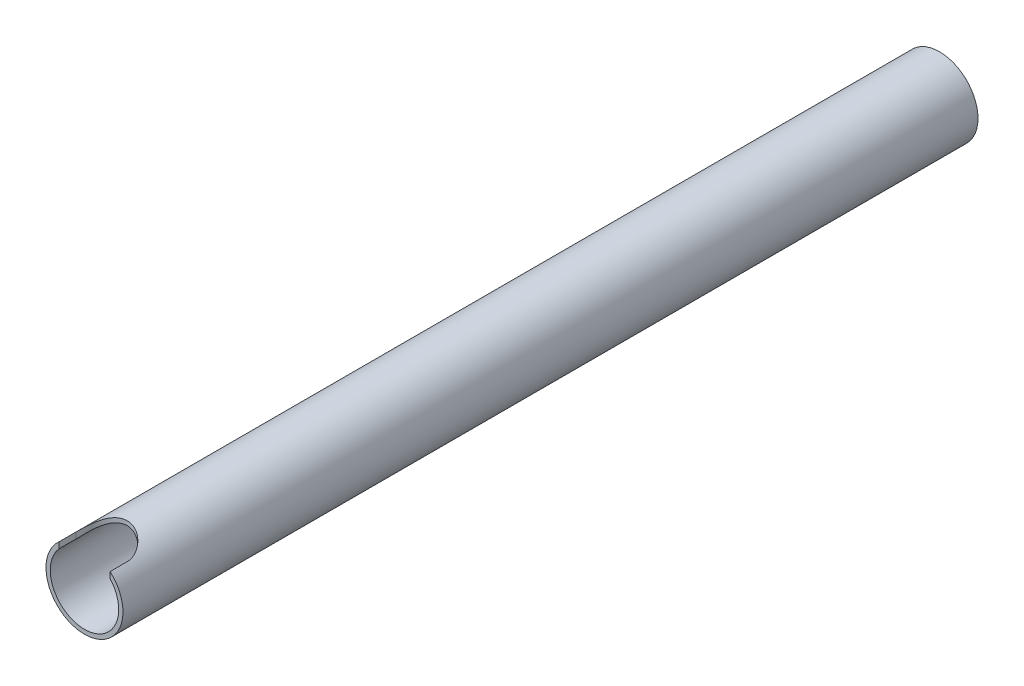
ISO-10303-21;
HEADER;
FILE_DESCRIPTION(('STEP AP214'),'2;1');
FILE_NAME('part.step','',(''),(''),'','','');
FILE_SCHEMA(('AUTOMOTIVE_DESIGN { 1 0 10303 214 1 1 1 1 }'));
ENDSEC;
DATA;
#1=APPLICATION_CONTEXT('core data for automotive mechanical design processes');
#2=APPLICATION_PROTOCOL_DEFINITION('international standard','automotive_design',2000,#1);
#3=PRODUCT_CONTEXT('',#1,'mechanical');
#4=PRODUCT('Part','Part','',(#3));
#5=PRODUCT_RELATED_PRODUCT_CATEGORY('part','',(#4));
#6=PRODUCT_DEFINITION_FORMATION('','',#4);
#7=PRODUCT_DEFINITION_CONTEXT('part definition',#1,'design');
#8=PRODUCT_DEFINITION('design','',#6,#7);
#9=PRODUCT_DEFINITION_SHAPE('','',#8);
#10=(LENGTH_UNIT() NAMED_UNIT(*) SI_UNIT(.MILLI.,.METRE.));
#11=(NAMED_UNIT(*) PLANE_ANGLE_UNIT() SI_UNIT($,.RADIAN.));
#12=(NAMED_UNIT(*) SI_UNIT($,.STERADIAN.) SOLID_ANGLE_UNIT());
#13=UNCERTAINTY_MEASURE_WITH_UNIT(LENGTH_MEASURE(1.E-05),#10,'distance_accuracy_value','');
#14=(GEOMETRIC_REPRESENTATION_CONTEXT(3) GLOBAL_UNCERTAINTY_ASSIGNED_CONTEXT((#13)) GLOBAL_UNIT_ASSIGNED_CONTEXT((#10,
#11,#12)) REPRESENTATION_CONTEXT('',''));
#15=CARTESIAN_POINT('',(0.,0.,0.));
#16=DIRECTION('',(0.,0.,1.));
#17=DIRECTION('',(1.,0.,0.));
#18=AXIS2_PLACEMENT_3D('',#15,#16,#17);
#19=CARTESIAN_POINT('',(0.,0.,200.));
#20=DIRECTION('',(0.,0.,1.));
#21=DIRECTION('',(1.,0.,0.));
#22=AXIS2_PLACEMENT_3D('',#19,#20,#21);
#23=PLANE('',#22);
#24=DIRECTION('',(0.,-1.,0.));
#25=VECTOR('',#24,1.);
#26=CARTESIAN_POINT('',(-6.,0.,200.));
#27=LINE('',#26,#25);
#28=CARTESIAN_POINT('',(-6.,6.70820393249937,200.));
#29=VERTEX_POINT('',#28);
#30=CARTESIAN_POINT('',(-6.,5.29150262212918,200.));
#31=VERTEX_POINT('',#30);
#32=EDGE_CURVE('E118',#29,#31,#27,.T.);
#33=ORIENTED_EDGE('',*,*,#32,.F.);
#34=CARTESIAN_POINT('',(0.,0.,200.));
#35=DIRECTION('',(0.,0.,1.));
#36=DIRECTION('',(1.,0.,0.));
#37=AXIS2_PLACEMENT_3D('',#34,#35,#36);
#38=CIRCLE('',#37,9.);
#39=CARTESIAN_POINT('',(6.,6.70820393249937,200.));
#40=VERTEX_POINT('',#39);
#41=EDGE_CURVE('E171',#29,#40,#38,.T.);
#42=ORIENTED_EDGE('',*,*,#41,.T.);
#43=DIRECTION('',(0.,1.,0.));
#44=VECTOR('',#43,1.);
#45=CARTESIAN_POINT('',(6.,0.,200.));
#46=LINE('',#45,#44);
#47=CARTESIAN_POINT('',(6.,5.29150262212918,200.));
#48=VERTEX_POINT('',#47);
#49=EDGE_CURVE('E109',#48,#40,#46,.T.);
#50=ORIENTED_EDGE('',*,*,#49,.F.);
#51=CARTESIAN_POINT('',(0.,0.,200.));
#52=DIRECTION('',(0.,0.,1.));
#53=DIRECTION('',(1.,0.,0.));
#54=AXIS2_PLACEMENT_3D('',#51,#52,#53);
#55=CIRCLE('',#54,8.);
#56=EDGE_CURVE('E162',#31,#48,#55,.T.);
#57=ORIENTED_EDGE('',*,*,#56,.F.);
#58=EDGE_LOOP('',(#33,#42,#50,#57));
#59=FACE_BOUND('',#58,.T.);
#60=ADVANCED_FACE('F43',(#59),#23,.T.);
#61=CARTESIAN_POINT('',(0.,0.,0.));
#62=DIRECTION('',(0.,0.,1.));
#63=DIRECTION('',(1.,0.,0.));
#64=AXIS2_PLACEMENT_3D('',#61,#62,#63);
#65=PLANE('',#64);
#66=CARTESIAN_POINT('',(0.,0.,0.));
#67=DIRECTION('',(0.,0.,1.));
#68=DIRECTION('',(1.,0.,0.));
#69=AXIS2_PLACEMENT_3D('',#66,#67,#68);
#70=CIRCLE('',#69,9.);
#71=CARTESIAN_POINT('',(9.,0.,0.));
#72=VERTEX_POINT('',#71);
#73=EDGE_CURVE('E159',#72,#72,#70,.T.);
#74=ORIENTED_EDGE('',*,*,#73,.F.);
#75=EDGE_LOOP('',(#74));
#76=FACE_BOUND('',#75,.T.);
#77=CARTESIAN_POINT('',(0.,0.,0.));
#78=DIRECTION('',(0.,0.,1.));
#79=DIRECTION('',(1.,0.,0.));
#80=AXIS2_PLACEMENT_3D('',#77,#78,#79);
#81=CIRCLE('',#80,8.);
#82=CARTESIAN_POINT('',(8.,0.,0.));
#83=VERTEX_POINT('',#82);
#84=EDGE_CURVE('E165',#83,#83,#81,.T.);
#85=ORIENTED_EDGE('',*,*,#84,.T.);
#86=EDGE_LOOP('',(#85));
#87=FACE_BOUND('',#86,.T.);
#88=ADVANCED_FACE('F146',(#76,#87),#65,.F.);
#89=CARTESIAN_POINT('',(0.,0.,200.));
#90=DIRECTION('',(0.,0.,-1.));
#91=DIRECTION('',(-1.,0.,0.));
#92=AXIS2_PLACEMENT_3D('',#89,#90,#91);
#93=CYLINDRICAL_SURFACE('',#92,9.);
#94=ORIENTED_EDGE('',*,*,#41,.F.);
#95=DIRECTION('',(0.,0.,-1.));
#96=VECTOR('',#95,1.);
#97=CARTESIAN_POINT('',(-6.,6.70820393249937,200.));
#98=LINE('',#97,#96);
#99=CARTESIAN_POINT('',(-6.,6.70820393249937,196.));
#100=VERTEX_POINT('',#99);
#101=EDGE_CURVE('E74',#29,#100,#98,.T.);
#102=ORIENTED_EDGE('',*,*,#101,.T.);
#103=CARTESIAN_POINT('',(-6.,6.70820393249937,196.));
#104=CARTESIAN_POINT('',(-6.0000393183433,6.70812194573574,195.852506980731));
#105=CARTESIAN_POINT('',(-5.99456347786238,6.71306593091113,195.705061652411));
#106=CARTESIAN_POINT('',(-5.97289327726244,6.73237859024483,195.411774037341));
#107=CARTESIAN_POINT('',(-5.95671328084198,6.74673463431257,195.265929868277));
#108=CARTESIAN_POINT('',(-5.91415607609064,6.78406215747855,194.978375981598));
#109=CARTESIAN_POINT('',(-5.88788106748825,6.8069472231382,194.836639667377));
#110=CARTESIAN_POINT('',(-5.82560066996816,6.86032556958915,194.556763780513));
#111=CARTESIAN_POINT('',(-5.78959245078331,6.89082106317695,194.418625266884));
#112=CARTESIAN_POINT('',(-5.70858199668009,6.95807725230193,194.147428771933));
#113=CARTESIAN_POINT('',(-5.66362787449207,6.994804284088,194.014347963361));
#114=CARTESIAN_POINT('',(-5.56512538409717,7.07342589112545,193.753028706149));
#115=CARTESIAN_POINT('',(-5.51157745308584,7.11532020347504,193.624790011584));
#116=CARTESIAN_POINT('',(-5.33842689493356,7.24722356567827,193.247177913208));
#117=CARTESIAN_POINT('',(-5.20649519991548,7.34329866853642,193.005493595962));
#118=CARTESIAN_POINT('',(-4.88998497472128,7.55844009542074,192.508915856898));
#119=CARTESIAN_POINT('',(-4.70042231706135,7.67876554502885,192.257747766865));
#120=CARTESIAN_POINT('',(-4.38847297427156,7.85848610554915,191.905379210826));
#121=CARTESIAN_POINT('',(-4.27982876675124,7.91829423228407,191.791937198901));
#122=CARTESIAN_POINT('',(-4.05351803224065,8.03649599254022,191.573519899));
#123=CARTESIAN_POINT('',(-3.93584941894303,8.09488929484438,191.468546580438));
#124=CARTESIAN_POINT('',(-3.67410276883844,8.21734571815794,191.25302928572));
#125=CARTESIAN_POINT('',(-3.52867128211092,8.28100042701004,191.143890846029));
#126=CARTESIAN_POINT('',(-3.22705781179329,8.40312749208883,190.938441866567));
#127=CARTESIAN_POINT('',(-3.07088087836644,8.46160225363382,190.842125362347));
#128=CARTESIAN_POINT('',(-2.7485550368627,8.57172289580967,190.663392008808));
#129=CARTESIAN_POINT('',(-2.58241066290611,8.62337184771766,190.580968903514));
#130=CARTESIAN_POINT('',(-2.24117837103793,8.71828288420858,190.431174670396));
#131=CARTESIAN_POINT('',(-2.06609237981828,8.76154676600818,190.363800316619));
#132=CARTESIAN_POINT('',(-1.72849691899763,8.83395011628131,190.251932590202));
#133=CARTESIAN_POINT('',(-1.56677951763714,8.8641295404735,190.205720420075));
#134=CARTESIAN_POINT('',(-1.23871765597762,8.91589255205311,190.126838317575));
#135=CARTESIAN_POINT('',(-1.0723735087317,8.93747671950317,190.094167471343));
#136=CARTESIAN_POINT('',(-0.736763503715932,8.97137649057705,190.042990402912));
#137=CARTESIAN_POINT('',(-0.567500918238733,8.98370186187713,190.024469252972));
#138=CARTESIAN_POINT('',(-0.227596501670302,8.99872901097531,190.001900549956));
#139=CARTESIAN_POINT('',(-0.056954868589227,9.00143214661064,189.997850954732));
#140=CARTESIAN_POINT('',(0.257909828093748,8.99746462243315,190.003803864367));
#141=CARTESIAN_POINT('',(0.40219455835203,8.99216016134809,190.01175826242));
#142=CARTESIAN_POINT('',(0.689453317178941,8.97470670280735,190.037998856573));
#143=CARTESIAN_POINT('',(0.832426917904149,8.96255554664857,190.056288311231));
#144=CARTESIAN_POINT('',(1.11594062243916,8.93168553622766,190.102940433048));
#145=CARTESIAN_POINT('',(1.25648156409055,8.91296899238517,190.131299556643));
#146=CARTESIAN_POINT('',(1.53431926186213,8.86936580246273,190.197735155283));
#147=CARTESIAN_POINT('',(1.67161473732113,8.84447676380638,190.235815398588));
#148=CARTESIAN_POINT('',(1.94151594437167,8.78916401420626,190.321051852994));
#149=CARTESIAN_POINT('',(2.07413974717568,8.75876529383256,190.368167137181));
#150=CARTESIAN_POINT('',(2.33470201598792,8.69294276948524,190.471092998353));
#151=CARTESIAN_POINT('',(2.46263881729357,8.65751720146291,190.526906628487));
#152=CARTESIAN_POINT('',(2.83849835595443,8.5446597697204,190.706612161669));
#153=CARTESIAN_POINT('',(3.07866953915028,8.46060488844629,190.842832550333));
#154=CARTESIAN_POINT('',(3.56489228702402,8.26853604776286,191.1639488568));
#155=CARTESIAN_POINT('',(3.80756841028923,8.15882511006946,191.35288906415));
#156=CARTESIAN_POINT('',(4.25998331649615,7.93199864466213,191.763721415403));
#157=CARTESIAN_POINT('',(4.46967121585829,7.81487206125219,191.985663457895));
#158=CARTESIAN_POINT('',(4.77234020904544,7.63161953706803,192.359155696051));
#159=CARTESIAN_POINT('',(4.8772295945531,7.56482963236636,192.500887078842));
#160=CARTESIAN_POINT('',(5.07463232509068,7.43385178781524,192.793857940915));
#161=CARTESIAN_POINT('',(5.16714277588728,7.36966445889255,192.945099631629));
#162=CARTESIAN_POINT('',(5.424891961227,7.18436432971937,193.412196144449));
#163=CARTESIAN_POINT('',(5.57088509041259,7.07017210785883,193.742080318463));
#164=CARTESIAN_POINT('',(5.77061895485414,6.90737596649755,194.336081892814));
#165=CARTESIAN_POINT('',(5.83874387569329,6.84936009029308,194.592758129275));
#166=CARTESIAN_POINT('',(5.91517353662353,6.78319958018771,194.985829861502));
#167=CARTESIAN_POINT('',(5.93634841066102,6.76463184262495,195.118054286599));
#168=CARTESIAN_POINT('',(5.96984487292608,6.73509265405631,195.384427253078));
#169=CARTESIAN_POINT('',(5.98217199357155,6.7241164562877,195.518574538489));
#170=CARTESIAN_POINT('',(5.99330844907521,6.71418405629563,195.71085756892));
#171=CARTESIAN_POINT('',(5.99581719087049,6.71194322091241,195.768644375282));
#172=CARTESIAN_POINT('',(5.99916266713708,6.70895310557702,195.884284727289));
#173=CARTESIAN_POINT('',(5.99999998296912,6.708203307008,195.942138242723));
#174=CARTESIAN_POINT('',(6.,6.70820393249937,196.));
#175=B_SPLINE_CURVE_WITH_KNOTS('',3,(#103,#104,#105,#106,#107,#108,#109,#110,#111,#112,#113,
#114,#115,#116,#117,#118,#119,#120,#121,#122,#123,#124,#125,#126,#127,#128,#129,#130,#131,#132,
#133,#134,#135,#136,#137,#138,#139,#140,#141,#142,#143,#144,#145,#146,#147,#148,#149,#150,#151,
#152,#153,#154,#155,#156,#157,#158,#159,#160,#161,#162,#163,#164,#165,#166,#167,#168,#169,#170,
#171,#172,#173,#174),.UNSPECIFIED.,.F.,.F.,(4,2,2,2,2,2,2,2,2,2,2,2,2,2,2,2,2,2,2,2,2,2,2,2,2,2,
2,2,2,2,2,2,2,2,2,4),(0.,0.442218902060999,0.883845599550486,1.32111440562802,1.75851049975334,
2.19361485357492,2.62869707920835,3.50073479655623,4.50746081603578,5.01131940006734,
5.5152948218338,6.09247253881144,6.66938082173012,7.2460286341691,7.82255271359904,
8.33441185130012,8.84623643963211,9.35752031133303,9.86873203059137,10.3020102889807,
10.7354252327199,11.1686878065584,11.6021185844215,12.0336305045627,12.4652942294365,
13.3279876664779,14.3040591784731,15.2816218010343,15.8466542882344,16.411818651815,
17.5394361699494,18.3513876988232,18.7565175336659,19.1613938233755,19.3350122681653,
19.5085703139019),.UNSPECIFIED.);
#176=CARTESIAN_POINT('',(6.,6.70820393249937,196.));
#177=VERTEX_POINT('',#176);
#178=EDGE_CURVE('E99',#100,#177,#175,.T.);
#179=ORIENTED_EDGE('',*,*,#178,.T.);
#180=DIRECTION('',(0.,0.,-1.));
#181=VECTOR('',#180,1.);
#182=CARTESIAN_POINT('',(6.,6.70820393249937,200.));
#183=LINE('',#182,#181);
#184=EDGE_CURVE('E108',#177,#40,#183,.F.);
#185=ORIENTED_EDGE('',*,*,#184,.T.);
#186=EDGE_LOOP('',(#94,#102,#179,#185));
#187=FACE_BOUND('',#186,.T.);
#188=ORIENTED_EDGE('',*,*,#73,.T.);
#189=EDGE_LOOP('',(#188));
#190=FACE_BOUND('',#189,.T.);
#191=ADVANCED_FACE('F44',(#187,#190),#93,.T.);
#192=CARTESIAN_POINT('',(0.,0.,200.));
#193=DIRECTION('',(0.,0.,-1.));
#194=DIRECTION('',(-1.,0.,0.));
#195=AXIS2_PLACEMENT_3D('',#192,#193,#194);
#196=CYLINDRICAL_SURFACE('',#195,8.);
#197=DIRECTION('',(0.,0.,-1.));
#198=VECTOR('',#197,1.);
#199=CARTESIAN_POINT('',(-6.,5.29150262212918,200.));
#200=LINE('',#199,#198);
#201=CARTESIAN_POINT('',(-6.,5.29150262212918,196.));
#202=VERTEX_POINT('',#201);
#203=EDGE_CURVE('E11',#31,#202,#200,.T.);
#204=ORIENTED_EDGE('',*,*,#203,.F.);
#205=ORIENTED_EDGE('',*,*,#56,.T.);
#206=DIRECTION('',(0.,0.,-1.));
#207=VECTOR('',#206,1.);
#208=CARTESIAN_POINT('',(6.,5.29150262212918,200.));
#209=LINE('',#208,#207);
#210=CARTESIAN_POINT('',(6.,5.29150262212918,196.));
#211=VERTEX_POINT('',#210);
#212=EDGE_CURVE('E141',#211,#48,#209,.F.);
#213=ORIENTED_EDGE('',*,*,#212,.F.);
#214=CARTESIAN_POINT('',(-6.,5.29150262212918,196.));
#215=CARTESIAN_POINT('',(-6.00000164734553,5.29149746130063,195.929299215689));
#216=CARTESIAN_POINT('',(-5.99874992483121,5.29292042134915,195.858612431604));
#217=CARTESIAN_POINT('',(-5.99375929848811,5.29857251101417,195.717450627859));
#218=CARTESIAN_POINT('',(-5.99002081044604,5.30280117151782,195.646975574775));
#219=CARTESIAN_POINT('',(-5.97512726223536,5.31959499598561,195.436438424863));
#220=CARTESIAN_POINT('',(-5.96029391667244,5.33626847732026,195.296930503187));
#221=CARTESIAN_POINT('',(-5.92146467708413,5.37931891935372,195.02264831947));
#222=CARTESIAN_POINT('',(-5.89758872729309,5.40556869603609,194.887836295229));
#223=CARTESIAN_POINT('',(-5.84118213277231,5.46647153069185,194.621931044734));
#224=CARTESIAN_POINT('',(-5.80864733570754,5.50112861966951,194.49083963616));
#225=CARTESIAN_POINT('',(-5.73578091551817,5.57705609976159,194.234076022853));
#226=CARTESIAN_POINT('',(-5.69551468906141,5.61827055638512,194.108368480834));
#227=CARTESIAN_POINT('',(-5.60752977965139,5.70609193113432,193.861596067816));
#228=CARTESIAN_POINT('',(-5.55981184109297,5.7526983105091,193.740530734582));
#229=CARTESIAN_POINT('',(-5.40571853410941,5.89900121175978,193.383599325024));
#230=CARTESIAN_POINT('',(-5.28863395224688,6.00493049059014,193.154793376452));
#231=CARTESIAN_POINT('',(-5.08003235744934,6.18093054783945,192.803606798809));
#232=CARTESIAN_POINT('',(-4.99673902321449,6.24859868310512,192.674948483868));
#233=CARTESIAN_POINT('',(-4.82093036772026,6.38521973153118,192.424807481964));
#234=CARTESIAN_POINT('',(-4.72841432126793,6.45417274537597,192.303325360472));
#235=CARTESIAN_POINT('',(-4.43720798879207,6.66090963382174,191.949759541453));
#236=CARTESIAN_POINT('',(-4.22484445848777,6.79858453976931,191.728531124821));
#237=CARTESIAN_POINT('',(-3.85677854448346,7.01077089521444,191.400035472149));
#238=CARTESIAN_POINT('',(-3.71206447027489,7.08865432832994,191.282400060903));
#239=CARTESIAN_POINT('',(-3.41024785229984,7.23868552108811,191.05982239082));
#240=CARTESIAN_POINT('',(-3.25314252757324,7.31083198584902,190.954882994809));
#241=CARTESIAN_POINT('',(-2.92748738140682,7.44721036286365,190.759213349274));
#242=CARTESIAN_POINT('',(-2.75895787294117,7.5114557793649,190.668458781422));
#243=CARTESIAN_POINT('',(-2.41119946943849,7.6301911953997,190.502438157635));
#244=CARTESIAN_POINT('',(-2.2319763013099,7.68468635517768,190.427163905697));
#245=CARTESIAN_POINT('',(-1.91981544570525,7.76736517405681,190.313791142147));
#246=CARTESIAN_POINT('',(-1.78923137620704,7.79852622386618,190.271328994596));
#247=CARTESIAN_POINT('',(-1.52422909700309,7.85461977621466,190.195198861307));
#248=CARTESIAN_POINT('',(-1.3898118140051,7.87955377020367,190.161528769686));
#249=CARTESIAN_POINT('',(-1.1180230429965,7.92268544907432,190.103448250311));
#250=CARTESIAN_POINT('',(-0.980653655025508,7.94088776510486,190.079031456338));
#251=CARTESIAN_POINT('',(-0.703792112495761,7.9701977558813,190.03977994756));
#252=CARTESIAN_POINT('',(-0.564299882018418,7.9813051762812,190.024945576277));
#253=CARTESIAN_POINT('',(-0.283857320899895,7.99619868039414,190.005065723171));
#254=CARTESIAN_POINT('',(-0.142904119696008,7.99996542591576,190.000046097089));
#255=CARTESIAN_POINT('',(0.139006716824936,8.00003409940456,189.999954535817));
#256=CARTESIAN_POINT('',(0.279964352122297,7.99633605683647,190.004882561363));
#257=CARTESIAN_POINT('',(0.56082213053902,7.98155736180775,190.024608757108));
#258=CARTESIAN_POINT('',(0.700722059237648,7.97047525097633,190.03940887707));
#259=CARTESIAN_POINT('',(0.978397724164498,7.94117321022885,190.07864865745));
#260=CARTESIAN_POINT('',(1.11617347450189,7.92295332774438,190.103088253812));
#261=CARTESIAN_POINT('',(1.3839551510545,7.88050768014737,190.160243554479));
#262=CARTESIAN_POINT('',(1.51406502760778,7.85651130758527,190.192643953359));
#263=CARTESIAN_POINT('',(1.77072992844799,7.8026752011739,190.265687098327));
#264=CARTESIAN_POINT('',(1.89728371438224,7.7728334599092,190.306332676143));
#265=CARTESIAN_POINT('',(2.27058720904833,7.67531280863459,190.439948434221));
#266=CARTESIAN_POINT('',(2.51116863882605,7.59960732816932,190.544638930134));
#267=CARTESIAN_POINT('',(2.9969153602917,7.42243473030987,190.794130794891));
#268=CARTESIAN_POINT('',(3.23975440607125,7.31906538668208,190.942048607236));
#269=CARTESIAN_POINT('',(3.69829736350047,7.09840449015697,191.266963816457));
#270=CARTESIAN_POINT('',(3.91398034333128,6.98110233158908,191.443983405509));
#271=CARTESIAN_POINT('',(4.23583596963117,6.78804083470792,191.747338267198));
#272=CARTESIAN_POINT('',(4.35122114890484,6.71450091073725,191.865505604413));
#273=CARTESIAN_POINT('',(4.57160313183084,6.56643304982319,192.110579711394));
#274=CARTESIAN_POINT('',(4.67660176414746,6.49190528942867,192.237484936064));
#275=CARTESIAN_POINT('',(4.87611364252768,6.34342206895683,192.499896498755));
#276=CARTESIAN_POINT('',(4.97061341127991,6.26946745530601,192.635413548974));
#277=CARTESIAN_POINT('',(5.14865041086736,6.12409941254336,192.914741514764));
#278=CARTESIAN_POINT('',(5.23219013690457,6.05268540773531,193.058550531787));
#279=CARTESIAN_POINT('',(5.37254365577724,5.92813404110711,193.325338733702));
#280=CARTESIAN_POINT('',(5.43138438442486,5.87416125485588,193.446863733178));
#281=CARTESIAN_POINT('',(5.5413408736172,5.77055000888551,193.695225150725));
#282=CARTESIAN_POINT('',(5.59245427231992,5.72091287629918,193.822063177644));
#283=CARTESIAN_POINT('',(5.68625012211941,5.62769176245618,194.08027559041));
#284=CARTESIAN_POINT('',(5.72896954127146,5.58408150227078,194.211626948687));
#285=CARTESIAN_POINT('',(5.80567365362211,5.5042910727892,194.478991477923));
#286=CARTESIAN_POINT('',(5.83966483280454,5.46810539030669,194.615001101627));
#287=CARTESIAN_POINT('',(5.89031205286352,5.41342854550062,194.853374139022));
#288=CARTESIAN_POINT('',(5.90916723672386,5.39280369759212,194.954785604311));
#289=CARTESIAN_POINT('',(5.94171986779775,5.35691605972682,195.159352566744));
#290=CARTESIAN_POINT('',(5.95541890485186,5.34165161704606,195.262507516037));
#291=CARTESIAN_POINT('',(5.97755949694622,5.31686736002835,195.470990602493));
#292=CARTESIAN_POINT('',(5.98595443847325,5.30739850056437,195.57632982725));
#293=CARTESIAN_POINT('',(5.99718514551604,5.29469401011652,195.787772528299));
#294=CARTESIAN_POINT('',(6.00001580245987,5.2914641071683,195.893876617216));
#295=CARTESIAN_POINT('',(6.,5.29150262212919,196.));
#296=B_SPLINE_CURVE_WITH_KNOTS('',3,(#214,#215,#216,#217,#218,#219,#220,#221,#222,#223,#224,
#225,#226,#227,#228,#229,#230,#231,#232,#233,#234,#235,#236,#237,#238,#239,#240,#241,#242,#243,
#244,#245,#246,#247,#248,#249,#250,#251,#252,#253,#254,#255,#256,#257,#258,#259,#260,#261,#262,
#263,#264,#265,#266,#267,#268,#269,#270,#271,#272,#273,#274,#275,#276,#277,#278,#279,#280,#281,
#282,#283,#284,#285,#286,#287,#288,#289,#290,#291,#292,#293,#294,#295),.UNSPECIFIED.,.F.,.F.,(4,
2,2,2,2,2,2,2,2,2,2,2,2,2,2,2,2,2,2,2,2,2,2,2,2,2,2,2,2,2,2,2,2,2,2,2,2,2,2,2,4),(0.,
0.212049935582529,0.42406442536758,0.847096983047166,1.26470438079724,1.68251240342031,
2.09693077200734,2.51130776838553,3.34263552478065,3.84490978127099,4.34722356338937,
5.35175523229734,5.957376761797,6.56313459941825,7.16784226315849,7.7722289374483,
8.19422783459786,8.61612556112341,9.03773249507414,9.45935454242826,9.88208581267284,
10.3048154143323,10.7276285308357,11.1504388377281,11.5586328901709,11.9669673710899,
12.7830530944666,13.6875367840661,14.5927134337423,15.1346425174526,15.6764760182129,
16.2189972201063,16.7613946945816,17.1972953536469,17.6333289766275,18.0673969560296,
18.5011414384825,18.8164661754747,19.1316936057844,19.4496541383768,19.7679064545729),.UNSPECIFIED.);
#297=EDGE_CURVE('E52',#202,#211,#296,.T.);
#298=ORIENTED_EDGE('',*,*,#297,.F.);
#299=EDGE_LOOP('',(#204,#205,#213,#298));
#300=FACE_BOUND('',#299,.T.);
#301=ORIENTED_EDGE('',*,*,#84,.F.);
#302=EDGE_LOOP('',(#301));
#303=FACE_BOUND('',#302,.T.);
#304=ADVANCED_FACE('F142',(#300,#303),#196,.F.);
#305=CARTESIAN_POINT('',(-6.,0.,204.));
#306=DIRECTION('',(-1.,0.,0.));
#307=DIRECTION('',(0.,0.,1.));
#308=AXIS2_PLACEMENT_3D('',#305,#306,#307);
#309=PLANE('',#308);
#310=ORIENTED_EDGE('',*,*,#32,.T.);
#311=ORIENTED_EDGE('',*,*,#203,.T.);
#312=DIRECTION('',(0.,1.,0.));
#313=VECTOR('',#312,1.);
#314=CARTESIAN_POINT('',(-6.,0.,196.));
#315=LINE('',#314,#313);
#316=EDGE_CURVE('E104',#202,#100,#315,.T.);
#317=ORIENTED_EDGE('',*,*,#316,.T.);
#318=ORIENTED_EDGE('',*,*,#101,.F.);
#319=EDGE_LOOP('',(#310,#311,#317,#318));
#320=FACE_BOUND('',#319,.T.);
#321=ADVANCED_FACE('F135',(#320),#309,.F.);
#322=CARTESIAN_POINT('',(0.,0.,196.));
#323=DIRECTION('',(0.,1.,0.));
#324=DIRECTION('',(0.,0.,1.));
#325=AXIS2_PLACEMENT_3D('',#322,#323,#324);
#326=CYLINDRICAL_SURFACE('',#325,6.);
#327=ORIENTED_EDGE('',*,*,#316,.F.);
#328=ORIENTED_EDGE('',*,*,#297,.T.);
#329=DIRECTION('',(0.,1.,0.));
#330=VECTOR('',#329,1.);
#331=CARTESIAN_POINT('',(6.,0.,196.));
#332=LINE('',#331,#330);
#333=EDGE_CURVE('E64',#211,#177,#332,.T.);
#334=ORIENTED_EDGE('',*,*,#333,.T.);
#335=ORIENTED_EDGE('',*,*,#178,.F.);
#336=EDGE_LOOP('',(#327,#328,#334,#335));
#337=FACE_BOUND('',#336,.T.);
#338=ADVANCED_FACE('F97',(#337),#326,.F.);
#339=CARTESIAN_POINT('',(6.,0.,204.));
#340=DIRECTION('',(1.,0.,0.));
#341=DIRECTION('',(0.,0.,-1.));
#342=AXIS2_PLACEMENT_3D('',#339,#340,#341);
#343=PLANE('',#342);
#344=ORIENTED_EDGE('',*,*,#333,.F.);
#345=ORIENTED_EDGE('',*,*,#212,.T.);
#346=ORIENTED_EDGE('',*,*,#49,.T.);
#347=ORIENTED_EDGE('',*,*,#184,.F.);
#348=EDGE_LOOP('',(#344,#345,#346,#347));
#349=FACE_BOUND('',#348,.T.);
#350=ADVANCED_FACE('F110',(#349),#343,.F.);
#351=CLOSED_SHELL('',(#60,#88,#191,#304,#321,#338,#350));
#352=MANIFOLD_SOLID_BREP('B2',#351);
#353=ADVANCED_BREP_SHAPE_REPRESENTATION('',(#18,#352),#14);
#354=SHAPE_DEFINITION_REPRESENTATION(#9,#353);
ENDSEC;
END-ISO-10303-21;
